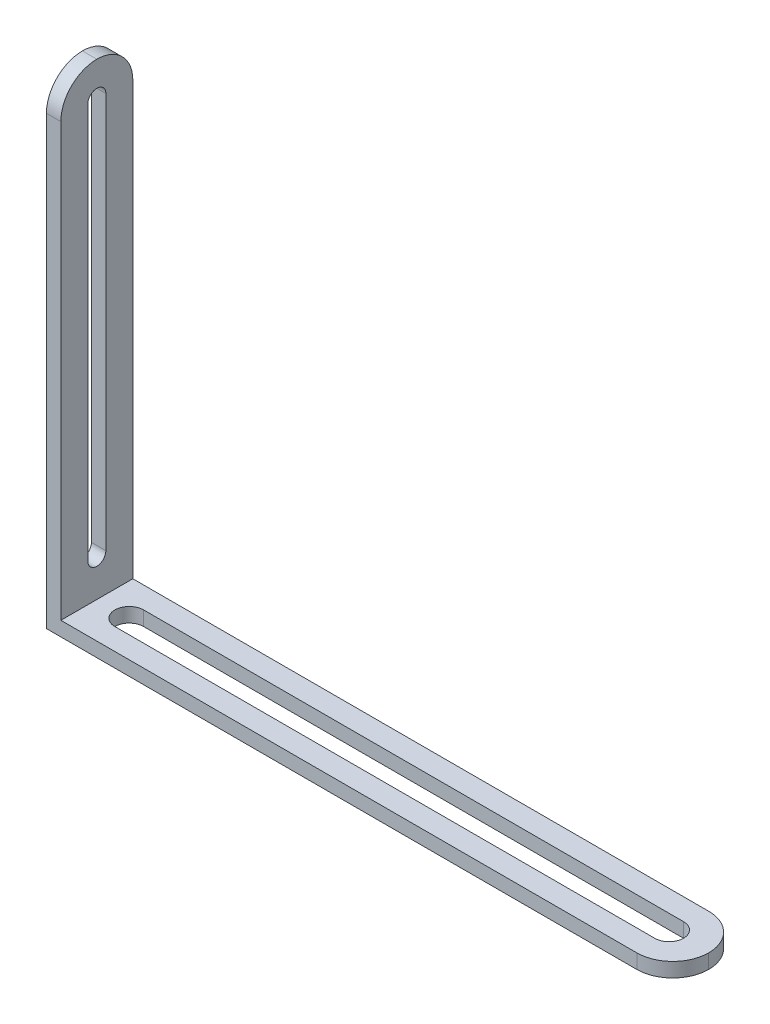
ISO-10303-21;
HEADER;
FILE_DESCRIPTION(('STEP AP214'),'2;1');
FILE_NAME('part.step','',(''),(''),'','','');
FILE_SCHEMA(('AUTOMOTIVE_DESIGN { 1 0 10303 214 1 1 1 1 }'));
ENDSEC;
DATA;
#1=APPLICATION_CONTEXT('core data for automotive mechanical design processes');
#2=APPLICATION_PROTOCOL_DEFINITION('international standard','automotive_design',2000,#1);
#3=PRODUCT_CONTEXT('',#1,'mechanical');
#4=PRODUCT('Part','Part','',(#3));
#5=PRODUCT_RELATED_PRODUCT_CATEGORY('part','',(#4));
#6=PRODUCT_DEFINITION_FORMATION('','',#4);
#7=PRODUCT_DEFINITION_CONTEXT('part definition',#1,'design');
#8=PRODUCT_DEFINITION('design','',#6,#7);
#9=PRODUCT_DEFINITION_SHAPE('','',#8);
#10=(LENGTH_UNIT() NAMED_UNIT(*) SI_UNIT(.MILLI.,.METRE.));
#11=(NAMED_UNIT(*) PLANE_ANGLE_UNIT() SI_UNIT($,.RADIAN.));
#12=(NAMED_UNIT(*) SI_UNIT($,.STERADIAN.) SOLID_ANGLE_UNIT());
#13=UNCERTAINTY_MEASURE_WITH_UNIT(LENGTH_MEASURE(1.E-05),#10,'distance_accuracy_value','');
#14=(GEOMETRIC_REPRESENTATION_CONTEXT(3) GLOBAL_UNCERTAINTY_ASSIGNED_CONTEXT((#13)) GLOBAL_UNIT_ASSIGNED_CONTEXT((#10,
#11,#12)) REPRESENTATION_CONTEXT('',''));
#15=CARTESIAN_POINT('',(0.,0.,0.));
#16=DIRECTION('',(0.,0.,1.));
#17=DIRECTION('',(1.,0.,0.));
#18=AXIS2_PLACEMENT_3D('',#15,#16,#17);
#19=CARTESIAN_POINT('',(0.,0.,-25.4));
#20=DIRECTION('',(-1.,0.,0.));
#21=DIRECTION('',(0.,0.,1.));
#22=AXIS2_PLACEMENT_3D('',#19,#20,#21);
#23=PLANE('',#22);
#24=CARTESIAN_POINT('',(0.,158.115,-12.7));
#25=DIRECTION('',(-1.,0.,0.));
#26=DIRECTION('',(0.,0.,1.));
#27=AXIS2_PLACEMENT_3D('',#24,#25,#26);
#28=CIRCLE('',#27,3.175);
#29=CARTESIAN_POINT('',(0.,158.115,-9.525));
#30=VERTEX_POINT('',#29);
#31=CARTESIAN_POINT('',(0.,158.115,-15.875));
#32=VERTEX_POINT('',#31);
#33=EDGE_CURVE('E228',#30,#32,#28,.T.);
#34=ORIENTED_EDGE('',*,*,#33,.F.);
#35=DIRECTION('',(0.,1.,0.));
#36=VECTOR('',#35,1.);
#37=CARTESIAN_POINT('',(0.,0.,-9.52500000000002));
#38=LINE('',#37,#36);
#39=CARTESIAN_POINT('',(0.,18.415,-9.52500000000002));
#40=VERTEX_POINT('',#39);
#41=EDGE_CURVE('E209',#40,#30,#38,.T.);
#42=ORIENTED_EDGE('',*,*,#41,.F.);
#43=CARTESIAN_POINT('',(0.,18.415,-12.7));
#44=DIRECTION('',(-1.,0.,0.));
#45=DIRECTION('',(0.,0.,1.));
#46=AXIS2_PLACEMENT_3D('',#43,#44,#45);
#47=CIRCLE('',#46,3.175);
#48=CARTESIAN_POINT('',(0.,18.415,-15.875));
#49=VERTEX_POINT('',#48);
#50=EDGE_CURVE('E221',#49,#40,#47,.T.);
#51=ORIENTED_EDGE('',*,*,#50,.F.);
#52=DIRECTION('',(0.,-1.,0.));
#53=VECTOR('',#52,1.);
#54=CARTESIAN_POINT('',(0.,0.,-15.875));
#55=LINE('',#54,#53);
#56=EDGE_CURVE('E225',#32,#49,#55,.T.);
#57=ORIENTED_EDGE('',*,*,#56,.F.);
#58=EDGE_LOOP('',(#34,#42,#51,#57));
#59=FACE_BOUND('',#58,.T.);
#60=CARTESIAN_POINT('',(0.,157.48,-12.7));
#61=DIRECTION('',(-1.,0.,0.));
#62=DIRECTION('',(0.,0.,1.));
#63=AXIS2_PLACEMENT_3D('',#60,#61,#62);
#64=CIRCLE('',#63,12.7);
#65=CARTESIAN_POINT('',(0.,157.48,0.));
#66=VERTEX_POINT('',#65);
#67=CARTESIAN_POINT('',(0.,170.18,-12.7));
#68=VERTEX_POINT('',#67);
#69=EDGE_CURVE('E295',#66,#68,#64,.T.);
#70=ORIENTED_EDGE('',*,*,#69,.T.);
#71=CARTESIAN_POINT('',(0.,157.48,-12.7));
#72=DIRECTION('',(-1.,0.,0.));
#73=DIRECTION('',(0.,0.,1.));
#74=AXIS2_PLACEMENT_3D('',#71,#72,#73);
#75=CIRCLE('',#74,12.7);
#76=CARTESIAN_POINT('',(0.,157.48,-25.4));
#77=VERTEX_POINT('',#76);
#78=EDGE_CURVE('E298',#68,#77,#75,.T.);
#79=ORIENTED_EDGE('',*,*,#78,.T.);
#80=DIRECTION('',(0.,-1.,0.));
#81=VECTOR('',#80,1.);
#82=CARTESIAN_POINT('',(0.,0.,-25.4));
#83=LINE('',#82,#81);
#84=CARTESIAN_POINT('',(0.,0.,-25.4));
#85=VERTEX_POINT('',#84);
#86=EDGE_CURVE('E232',#77,#85,#83,.T.);
#87=ORIENTED_EDGE('',*,*,#86,.T.);
#88=DIRECTION('',(0.,0.,1.));
#89=VECTOR('',#88,1.);
#90=CARTESIAN_POINT('',(0.,0.,-25.4));
#91=LINE('',#90,#89);
#92=CARTESIAN_POINT('',(0.,0.,0.));
#93=VERTEX_POINT('',#92);
#94=EDGE_CURVE('E247',#85,#93,#91,.T.);
#95=ORIENTED_EDGE('',*,*,#94,.T.);
#96=DIRECTION('',(0.,-1.,0.));
#97=VECTOR('',#96,1.);
#98=CARTESIAN_POINT('',(0.,0.,0.));
#99=LINE('',#98,#97);
#100=EDGE_CURVE('E248',#66,#93,#99,.T.);
#101=ORIENTED_EDGE('',*,*,#100,.F.);
#102=EDGE_LOOP('',(#70,#79,#87,#95,#101));
#103=FACE_BOUND('',#102,.T.);
#104=ADVANCED_FACE('F41',(#59,#103),#23,.T.);
#105=CARTESIAN_POINT('',(5.07999999999996,170.18,-25.4));
#106=DIRECTION('',(1.,0.,0.));
#107=DIRECTION('',(0.,1.,0.));
#108=AXIS2_PLACEMENT_3D('',#105,#106,#107);
#109=PLANE('',#108);
#110=CARTESIAN_POINT('',(5.07999999999996,158.115,-12.7));
#111=DIRECTION('',(1.,0.,0.));
#112=DIRECTION('',(0.,1.,0.));
#113=AXIS2_PLACEMENT_3D('',#110,#111,#112);
#114=CIRCLE('',#113,3.175);
#115=CARTESIAN_POINT('',(5.07999999999996,158.115,-15.875));
#116=VERTEX_POINT('',#115);
#117=CARTESIAN_POINT('',(5.07999999999996,158.115,-9.525));
#118=VERTEX_POINT('',#117);
#119=EDGE_CURVE('E186',#116,#118,#114,.T.);
#120=ORIENTED_EDGE('',*,*,#119,.F.);
#121=DIRECTION('',(0.,1.,0.));
#122=VECTOR('',#121,1.);
#123=CARTESIAN_POINT('',(5.07999999999996,158.115,-15.875));
#124=LINE('',#123,#122);
#125=CARTESIAN_POINT('',(5.07999999999998,18.415,-15.875));
#126=VERTEX_POINT('',#125);
#127=EDGE_CURVE('E201',#126,#116,#124,.T.);
#128=ORIENTED_EDGE('',*,*,#127,.F.);
#129=CARTESIAN_POINT('',(5.07999999999998,18.415,-12.7));
#130=DIRECTION('',(1.,0.,0.));
#131=DIRECTION('',(0.,1.,0.));
#132=AXIS2_PLACEMENT_3D('',#129,#130,#131);
#133=CIRCLE('',#132,3.175);
#134=CARTESIAN_POINT('',(5.07999999999998,18.415,-9.52500000000002));
#135=VERTEX_POINT('',#134);
#136=EDGE_CURVE('E197',#135,#126,#133,.T.);
#137=ORIENTED_EDGE('',*,*,#136,.F.);
#138=DIRECTION('',(0.,-1.,0.));
#139=VECTOR('',#138,1.);
#140=CARTESIAN_POINT('',(5.07999999999996,158.115,-9.525));
#141=LINE('',#140,#139);
#142=EDGE_CURVE('E193',#118,#135,#141,.T.);
#143=ORIENTED_EDGE('',*,*,#142,.F.);
#144=EDGE_LOOP('',(#120,#128,#137,#143));
#145=FACE_BOUND('',#144,.T.);
#146=DIRECTION('',(0.,1.,0.));
#147=VECTOR('',#146,1.);
#148=CARTESIAN_POINT('',(5.07999999999996,170.18,-25.4));
#149=LINE('',#148,#147);
#150=CARTESIAN_POINT('',(5.07999999999998,5.08,-25.4));
#151=VERTEX_POINT('',#150);
#152=CARTESIAN_POINT('',(5.07999999999996,157.48,-25.4));
#153=VERTEX_POINT('',#152);
#154=EDGE_CURVE('E243',#151,#153,#149,.T.);
#155=ORIENTED_EDGE('',*,*,#154,.T.);
#156=CARTESIAN_POINT('',(5.07999999999996,157.48,-12.7));
#157=DIRECTION('',(1.,0.,0.));
#158=DIRECTION('',(0.,1.,0.));
#159=AXIS2_PLACEMENT_3D('',#156,#157,#158);
#160=CIRCLE('',#159,12.7);
#161=CARTESIAN_POINT('',(5.07999999999996,170.18,-12.7));
#162=VERTEX_POINT('',#161);
#163=EDGE_CURVE('E304',#153,#162,#160,.T.);
#164=ORIENTED_EDGE('',*,*,#163,.T.);
#165=CARTESIAN_POINT('',(5.07999999999996,157.48,-12.7));
#166=DIRECTION('',(1.,0.,0.));
#167=DIRECTION('',(0.,1.,0.));
#168=AXIS2_PLACEMENT_3D('',#165,#166,#167);
#169=CIRCLE('',#168,12.7);
#170=CARTESIAN_POINT('',(5.07999999999996,157.48,0.));
#171=VERTEX_POINT('',#170);
#172=EDGE_CURVE('E301',#162,#171,#169,.T.);
#173=ORIENTED_EDGE('',*,*,#172,.T.);
#174=DIRECTION('',(0.,1.,0.));
#175=VECTOR('',#174,1.);
#176=CARTESIAN_POINT('',(5.07999999999996,170.18,0.));
#177=LINE('',#176,#175);
#178=CARTESIAN_POINT('',(5.07999999999998,5.08,0.));
#179=VERTEX_POINT('',#178);
#180=EDGE_CURVE('E236',#179,#171,#177,.T.);
#181=ORIENTED_EDGE('',*,*,#180,.F.);
#182=DIRECTION('',(0.,0.,1.));
#183=VECTOR('',#182,1.);
#184=CARTESIAN_POINT('',(5.07999999999998,5.08,-25.4));
#185=LINE('',#184,#183);
#186=EDGE_CURVE('E262',#151,#179,#185,.T.);
#187=ORIENTED_EDGE('',*,*,#186,.F.);
#188=EDGE_LOOP('',(#155,#164,#173,#181,#187));
#189=FACE_BOUND('',#188,.T.);
#190=ADVANCED_FACE('F345',(#145,#189),#109,.T.);
#191=CARTESIAN_POINT('',(5.07999999999998,5.08,-25.4));
#192=DIRECTION('',(0.,1.,0.));
#193=DIRECTION('',(0.,0.,1.));
#194=AXIS2_PLACEMENT_3D('',#191,#192,#193);
#195=PLANE('',#194);
#196=CARTESIAN_POINT('',(207.01,5.08,-12.7));
#197=DIRECTION('',(0.,1.,0.));
#198=DIRECTION('',(0.,0.,1.));
#199=AXIS2_PLACEMENT_3D('',#196,#197,#198);
#200=CIRCLE('',#199,5.07999999999999);
#201=CARTESIAN_POINT('',(207.01,5.08,-7.62000000000001));
#202=VERTEX_POINT('',#201);
#203=CARTESIAN_POINT('',(207.01,5.08,-17.78));
#204=VERTEX_POINT('',#203);
#205=EDGE_CURVE('E57',#202,#204,#200,.T.);
#206=ORIENTED_EDGE('',*,*,#205,.F.);
#207=DIRECTION('',(1.,0.,0.));
#208=VECTOR('',#207,1.);
#209=CARTESIAN_POINT('',(207.01,5.08,-7.62000000000001));
#210=LINE('',#209,#208);
#211=CARTESIAN_POINT('',(16.5099999999999,5.08,-7.62000000000001));
#212=VERTEX_POINT('',#211);
#213=EDGE_CURVE('E175',#212,#202,#210,.T.);
#214=ORIENTED_EDGE('',*,*,#213,.F.);
#215=CARTESIAN_POINT('',(16.5099999999999,5.08,-12.7));
#216=DIRECTION('',(0.,1.,0.));
#217=DIRECTION('',(0.,0.,1.));
#218=AXIS2_PLACEMENT_3D('',#215,#216,#217);
#219=CIRCLE('',#218,5.07999999999999);
#220=CARTESIAN_POINT('',(16.5099999999999,5.08,-17.78));
#221=VERTEX_POINT('',#220);
#222=EDGE_CURVE('E157',#221,#212,#219,.T.);
#223=ORIENTED_EDGE('',*,*,#222,.F.);
#224=DIRECTION('',(-1.,0.,0.));
#225=VECTOR('',#224,1.);
#226=CARTESIAN_POINT('',(207.01,5.08,-17.78));
#227=LINE('',#226,#225);
#228=EDGE_CURVE('E167',#204,#221,#227,.T.);
#229=ORIENTED_EDGE('',*,*,#228,.F.);
#230=EDGE_LOOP('',(#206,#214,#223,#229));
#231=FACE_BOUND('',#230,.T.);
#232=CARTESIAN_POINT('',(208.28,5.08,-12.7));
#233=DIRECTION('',(0.,1.,0.));
#234=DIRECTION('',(0.,0.,1.));
#235=AXIS2_PLACEMENT_3D('',#232,#233,#234);
#236=CIRCLE('',#235,12.7);
#237=CARTESIAN_POINT('',(208.28,5.08,0.));
#238=VERTEX_POINT('',#237);
#239=CARTESIAN_POINT('',(220.98,5.08,-12.7));
#240=VERTEX_POINT('',#239);
#241=EDGE_CURVE('E266',#238,#240,#236,.T.);
#242=ORIENTED_EDGE('',*,*,#241,.T.);
#243=CARTESIAN_POINT('',(208.28,5.08,-12.7));
#244=DIRECTION('',(0.,1.,0.));
#245=DIRECTION('',(0.,0.,1.));
#246=AXIS2_PLACEMENT_3D('',#243,#244,#245);
#247=CIRCLE('',#246,12.7);
#248=CARTESIAN_POINT('',(208.28,5.08,-25.4));
#249=VERTEX_POINT('',#248);
#250=EDGE_CURVE('E272',#240,#249,#247,.T.);
#251=ORIENTED_EDGE('',*,*,#250,.T.);
#252=DIRECTION('',(-1.,0.,0.));
#253=VECTOR('',#252,1.);
#254=CARTESIAN_POINT('',(5.07999999999998,5.08,-25.4));
#255=LINE('',#254,#253);
#256=EDGE_CURVE('E240',#249,#151,#255,.T.);
#257=ORIENTED_EDGE('',*,*,#256,.T.);
#258=ORIENTED_EDGE('',*,*,#186,.T.);
#259=DIRECTION('',(-1.,0.,0.));
#260=VECTOR('',#259,1.);
#261=CARTESIAN_POINT('',(5.07999999999998,5.08,0.));
#262=LINE('',#261,#260);
#263=EDGE_CURVE('E256',#238,#179,#262,.T.);
#264=ORIENTED_EDGE('',*,*,#263,.F.);
#265=EDGE_LOOP('',(#242,#251,#257,#258,#264));
#266=FACE_BOUND('',#265,.T.);
#267=ADVANCED_FACE('F172',(#231,#266),#195,.T.);
#268=CARTESIAN_POINT('',(220.98,0.,-25.4));
#269=DIRECTION('',(0.,-1.,0.));
#270=DIRECTION('',(1.,0.,0.));
#271=AXIS2_PLACEMENT_3D('',#268,#269,#270);
#272=PLANE('',#271);
#273=CARTESIAN_POINT('',(207.01,0.,-12.7));
#274=DIRECTION('',(0.,-1.,0.));
#275=DIRECTION('',(1.,0.,0.));
#276=AXIS2_PLACEMENT_3D('',#273,#274,#275);
#277=CIRCLE('',#276,5.07999999999999);
#278=CARTESIAN_POINT('',(207.01,0.,-17.78));
#279=VERTEX_POINT('',#278);
#280=CARTESIAN_POINT('',(207.01,0.,-7.62000000000001));
#281=VERTEX_POINT('',#280);
#282=EDGE_CURVE('E11',#279,#281,#277,.T.);
#283=ORIENTED_EDGE('',*,*,#282,.F.);
#284=DIRECTION('',(1.,0.,0.));
#285=VECTOR('',#284,1.);
#286=CARTESIAN_POINT('',(220.98,0.,-17.78));
#287=LINE('',#286,#285);
#288=CARTESIAN_POINT('',(16.5099999999999,0.,-17.78));
#289=VERTEX_POINT('',#288);
#290=EDGE_CURVE('E307',#289,#279,#287,.T.);
#291=ORIENTED_EDGE('',*,*,#290,.F.);
#292=CARTESIAN_POINT('',(16.5099999999999,0.,-12.7));
#293=DIRECTION('',(0.,-1.,0.));
#294=DIRECTION('',(1.,0.,0.));
#295=AXIS2_PLACEMENT_3D('',#292,#293,#294);
#296=CIRCLE('',#295,5.07999999999999);
#297=CARTESIAN_POINT('',(16.5099999999999,0.,-7.62000000000001));
#298=VERTEX_POINT('',#297);
#299=EDGE_CURVE('E160',#298,#289,#296,.T.);
#300=ORIENTED_EDGE('',*,*,#299,.F.);
#301=DIRECTION('',(-1.,0.,0.));
#302=VECTOR('',#301,1.);
#303=CARTESIAN_POINT('',(220.98,0.,-7.62000000000002));
#304=LINE('',#303,#302);
#305=EDGE_CURVE('E50',#281,#298,#304,.T.);
#306=ORIENTED_EDGE('',*,*,#305,.F.);
#307=EDGE_LOOP('',(#283,#291,#300,#306));
#308=FACE_BOUND('',#307,.T.);
#309=DIRECTION('',(1.,0.,0.));
#310=VECTOR('',#309,1.);
#311=CARTESIAN_POINT('',(220.98,0.,-25.4));
#312=LINE('',#311,#310);
#313=CARTESIAN_POINT('',(208.28,0.,-25.4));
#314=VERTEX_POINT('',#313);
#315=EDGE_CURVE('E235',#85,#314,#312,.T.);
#316=ORIENTED_EDGE('',*,*,#315,.T.);
#317=CARTESIAN_POINT('',(208.28,0.,-12.7));
#318=DIRECTION('',(0.,-1.,0.));
#319=DIRECTION('',(1.,0.,0.));
#320=AXIS2_PLACEMENT_3D('',#317,#318,#319);
#321=CIRCLE('',#320,12.7);
#322=CARTESIAN_POINT('',(220.98,0.,-12.7));
#323=VERTEX_POINT('',#322);
#324=EDGE_CURVE('E286',#314,#323,#321,.T.);
#325=ORIENTED_EDGE('',*,*,#324,.T.);
#326=CARTESIAN_POINT('',(208.28,0.,-12.7));
#327=DIRECTION('',(0.,-1.,0.));
#328=DIRECTION('',(1.,0.,0.));
#329=AXIS2_PLACEMENT_3D('',#326,#327,#328);
#330=CIRCLE('',#329,12.7);
#331=CARTESIAN_POINT('',(208.28,0.,0.));
#332=VERTEX_POINT('',#331);
#333=EDGE_CURVE('E283',#323,#332,#330,.T.);
#334=ORIENTED_EDGE('',*,*,#333,.T.);
#335=DIRECTION('',(1.,0.,0.));
#336=VECTOR('',#335,1.);
#337=CARTESIAN_POINT('',(220.98,0.,0.));
#338=LINE('',#337,#336);
#339=EDGE_CURVE('E251',#93,#332,#338,.T.);
#340=ORIENTED_EDGE('',*,*,#339,.F.);
#341=ORIENTED_EDGE('',*,*,#94,.F.);
#342=EDGE_LOOP('',(#316,#325,#334,#340,#341));
#343=FACE_BOUND('',#342,.T.);
#344=ADVANCED_FACE('F325',(#308,#343),#272,.T.);
#345=CARTESIAN_POINT('',(0.,0.,-25.4));
#346=DIRECTION('',(0.,0.,-1.));
#347=DIRECTION('',(-1.,0.,0.));
#348=AXIS2_PLACEMENT_3D('',#345,#346,#347);
#349=PLANE('',#348);
#350=ORIENTED_EDGE('',*,*,#256,.F.);
#351=DIRECTION('',(0.,1.,0.));
#352=VECTOR('',#351,1.);
#353=CARTESIAN_POINT('',(208.28,0.,-25.4));
#354=LINE('',#353,#352);
#355=EDGE_CURVE('E279',#249,#314,#354,.F.);
#356=ORIENTED_EDGE('',*,*,#355,.T.);
#357=ORIENTED_EDGE('',*,*,#315,.F.);
#358=ORIENTED_EDGE('',*,*,#86,.F.);
#359=DIRECTION('',(-1.,0.,0.));
#360=VECTOR('',#359,1.);
#361=CARTESIAN_POINT('',(0.,157.48,-25.4));
#362=LINE('',#361,#360);
#363=EDGE_CURVE('E275',#77,#153,#362,.F.);
#364=ORIENTED_EDGE('',*,*,#363,.T.);
#365=ORIENTED_EDGE('',*,*,#154,.F.);
#366=EDGE_LOOP('',(#350,#356,#357,#358,#364,#365));
#367=FACE_BOUND('',#366,.T.);
#368=ADVANCED_FACE('F387',(#367),#349,.T.);
#369=CARTESIAN_POINT('',(0.,0.,0.));
#370=DIRECTION('',(0.,0.,-1.));
#371=DIRECTION('',(-1.,0.,0.));
#372=AXIS2_PLACEMENT_3D('',#369,#370,#371);
#373=PLANE('',#372);
#374=ORIENTED_EDGE('',*,*,#339,.T.);
#375=DIRECTION('',(0.,1.,0.));
#376=VECTOR('',#375,1.);
#377=CARTESIAN_POINT('',(208.28,5.08,0.));
#378=LINE('',#377,#376);
#379=EDGE_CURVE('E292',#332,#238,#378,.T.);
#380=ORIENTED_EDGE('',*,*,#379,.T.);
#381=ORIENTED_EDGE('',*,*,#263,.T.);
#382=ORIENTED_EDGE('',*,*,#180,.T.);
#383=DIRECTION('',(-1.,0.,0.));
#384=VECTOR('',#383,1.);
#385=CARTESIAN_POINT('',(0.,157.48,0.));
#386=LINE('',#385,#384);
#387=EDGE_CURVE('E289',#171,#66,#386,.T.);
#388=ORIENTED_EDGE('',*,*,#387,.T.);
#389=ORIENTED_EDGE('',*,*,#100,.T.);
#390=EDGE_LOOP('',(#374,#380,#381,#382,#388,#389));
#391=FACE_BOUND('',#390,.T.);
#392=ADVANCED_FACE('F364',(#391),#373,.F.);
#393=CARTESIAN_POINT('',(208.28,0.,-12.7));
#394=DIRECTION('',(0.,-1.,0.));
#395=DIRECTION('',(0.,0.,-1.));
#396=AXIS2_PLACEMENT_3D('',#393,#394,#395);
#397=CYLINDRICAL_SURFACE('',#396,12.7);
#398=ORIENTED_EDGE('',*,*,#379,.F.);
#399=ORIENTED_EDGE('',*,*,#333,.F.);
#400=DIRECTION('',(0.,1.,0.));
#401=VECTOR('',#400,1.);
#402=CARTESIAN_POINT('',(220.98,0.,-12.7));
#403=LINE('',#402,#401);
#404=EDGE_CURVE('E252',#240,#323,#403,.F.);
#405=ORIENTED_EDGE('',*,*,#404,.F.);
#406=ORIENTED_EDGE('',*,*,#241,.F.);
#407=EDGE_LOOP('',(#398,#399,#405,#406));
#408=FACE_BOUND('',#407,.T.);
#409=ADVANCED_FACE('F361',(#408),#397,.T.);
#410=CARTESIAN_POINT('',(208.28,5.08,-12.7));
#411=DIRECTION('',(0.,1.,0.));
#412=DIRECTION('',(0.,0.,1.));
#413=AXIS2_PLACEMENT_3D('',#410,#411,#412);
#414=CYLINDRICAL_SURFACE('',#413,12.7);
#415=ORIENTED_EDGE('',*,*,#324,.F.);
#416=ORIENTED_EDGE('',*,*,#355,.F.);
#417=ORIENTED_EDGE('',*,*,#250,.F.);
#418=ORIENTED_EDGE('',*,*,#404,.T.);
#419=EDGE_LOOP('',(#415,#416,#417,#418));
#420=FACE_BOUND('',#419,.T.);
#421=ADVANCED_FACE('F358',(#420),#414,.T.);
#422=CARTESIAN_POINT('',(0.,157.48,-12.7));
#423=DIRECTION('',(1.,0.,0.));
#424=DIRECTION('',(0.,0.,-1.));
#425=AXIS2_PLACEMENT_3D('',#422,#423,#424);
#426=CYLINDRICAL_SURFACE('',#425,12.7);
#427=ORIENTED_EDGE('',*,*,#387,.F.);
#428=ORIENTED_EDGE('',*,*,#172,.F.);
#429=DIRECTION('',(-1.,0.,0.));
#430=VECTOR('',#429,1.);
#431=CARTESIAN_POINT('',(5.07999999999996,170.18,-12.7));
#432=LINE('',#431,#430);
#433=EDGE_CURVE('E231',#68,#162,#432,.F.);
#434=ORIENTED_EDGE('',*,*,#433,.F.);
#435=ORIENTED_EDGE('',*,*,#69,.F.);
#436=EDGE_LOOP('',(#427,#428,#434,#435));
#437=FACE_BOUND('',#436,.T.);
#438=ADVANCED_FACE('F43',(#437),#426,.T.);
#439=CARTESIAN_POINT('',(0.,157.48,-12.7));
#440=DIRECTION('',(-1.,0.,0.));
#441=DIRECTION('',(0.,0.,1.));
#442=AXIS2_PLACEMENT_3D('',#439,#440,#441);
#443=CYLINDRICAL_SURFACE('',#442,12.7);
#444=ORIENTED_EDGE('',*,*,#163,.F.);
#445=ORIENTED_EDGE('',*,*,#363,.F.);
#446=ORIENTED_EDGE('',*,*,#78,.F.);
#447=ORIENTED_EDGE('',*,*,#433,.T.);
#448=EDGE_LOOP('',(#444,#445,#446,#447));
#449=FACE_BOUND('',#448,.T.);
#450=ADVANCED_FACE('F366',(#449),#443,.T.);
#451=CARTESIAN_POINT('',(-20.32,158.115,-12.7));
#452=DIRECTION('',(1.,0.,0.));
#453=DIRECTION('',(0.,1.,0.));
#454=AXIS2_PLACEMENT_3D('',#451,#452,#453);
#455=CYLINDRICAL_SURFACE('',#454,3.175);
#456=ORIENTED_EDGE('',*,*,#33,.T.);
#457=DIRECTION('',(1.,0.,0.));
#458=VECTOR('',#457,1.);
#459=CARTESIAN_POINT('',(-20.32,158.115,-15.875));
#460=LINE('',#459,#458);
#461=EDGE_CURVE('E206',#32,#116,#460,.T.);
#462=ORIENTED_EDGE('',*,*,#461,.T.);
#463=ORIENTED_EDGE('',*,*,#119,.T.);
#464=DIRECTION('',(1.,0.,0.));
#465=VECTOR('',#464,1.);
#466=CARTESIAN_POINT('',(-20.32,158.115,-9.525));
#467=LINE('',#466,#465);
#468=EDGE_CURVE('E205',#30,#118,#467,.T.);
#469=ORIENTED_EDGE('',*,*,#468,.F.);
#470=EDGE_LOOP('',(#456,#462,#463,#469));
#471=FACE_BOUND('',#470,.T.);
#472=ADVANCED_FACE('F368',(#471),#455,.F.);
#473=CARTESIAN_POINT('',(-20.32,158.115,-15.875));
#474=DIRECTION('',(0.,0.,-1.));
#475=DIRECTION('',(0.,1.,0.));
#476=AXIS2_PLACEMENT_3D('',#473,#474,#475);
#477=PLANE('',#476);
#478=ORIENTED_EDGE('',*,*,#56,.T.);
#479=DIRECTION('',(1.,0.,0.));
#480=VECTOR('',#479,1.);
#481=CARTESIAN_POINT('',(-20.32,18.415,-15.875));
#482=LINE('',#481,#480);
#483=EDGE_CURVE('E210',#49,#126,#482,.T.);
#484=ORIENTED_EDGE('',*,*,#483,.T.);
#485=ORIENTED_EDGE('',*,*,#127,.T.);
#486=ORIENTED_EDGE('',*,*,#461,.F.);
#487=EDGE_LOOP('',(#478,#484,#485,#486));
#488=FACE_BOUND('',#487,.T.);
#489=ADVANCED_FACE('F374',(#488),#477,.F.);
#490=CARTESIAN_POINT('',(-20.32,18.415,-12.7));
#491=DIRECTION('',(1.,0.,0.));
#492=DIRECTION('',(0.,1.,0.));
#493=AXIS2_PLACEMENT_3D('',#490,#491,#492);
#494=CYLINDRICAL_SURFACE('',#493,3.175);
#495=ORIENTED_EDGE('',*,*,#50,.T.);
#496=DIRECTION('',(1.,0.,0.));
#497=VECTOR('',#496,1.);
#498=CARTESIAN_POINT('',(-20.32,18.415,-9.52500000000002));
#499=LINE('',#498,#497);
#500=EDGE_CURVE('E213',#40,#135,#499,.T.);
#501=ORIENTED_EDGE('',*,*,#500,.T.);
#502=ORIENTED_EDGE('',*,*,#136,.T.);
#503=ORIENTED_EDGE('',*,*,#483,.F.);
#504=EDGE_LOOP('',(#495,#501,#502,#503));
#505=FACE_BOUND('',#504,.T.);
#506=ADVANCED_FACE('F339',(#505),#494,.F.);
#507=CARTESIAN_POINT('',(-20.32,158.115,-9.525));
#508=DIRECTION('',(0.,0.,1.));
#509=DIRECTION('',(0.,-1.,0.));
#510=AXIS2_PLACEMENT_3D('',#507,#508,#509);
#511=PLANE('',#510);
#512=ORIENTED_EDGE('',*,*,#41,.T.);
#513=ORIENTED_EDGE('',*,*,#468,.T.);
#514=ORIENTED_EDGE('',*,*,#142,.T.);
#515=ORIENTED_EDGE('',*,*,#500,.F.);
#516=EDGE_LOOP('',(#512,#513,#514,#515));
#517=FACE_BOUND('',#516,.T.);
#518=ADVANCED_FACE('F332',(#517),#511,.F.);
#519=CARTESIAN_POINT('',(207.01,-20.32,-12.7));
#520=DIRECTION('',(0.,1.,0.));
#521=DIRECTION('',(0.,0.,1.));
#522=AXIS2_PLACEMENT_3D('',#519,#520,#521);
#523=CYLINDRICAL_SURFACE('',#522,5.07999999999999);
#524=ORIENTED_EDGE('',*,*,#282,.T.);
#525=DIRECTION('',(0.,1.,0.));
#526=VECTOR('',#525,1.);
#527=CARTESIAN_POINT('',(207.01,-20.32,-7.62000000000001));
#528=LINE('',#527,#526);
#529=EDGE_CURVE('E183',#281,#202,#528,.T.);
#530=ORIENTED_EDGE('',*,*,#529,.T.);
#531=ORIENTED_EDGE('',*,*,#205,.T.);
#532=DIRECTION('',(0.,1.,0.));
#533=VECTOR('',#532,1.);
#534=CARTESIAN_POINT('',(207.01,-20.32,-17.78));
#535=LINE('',#534,#533);
#536=EDGE_CURVE('E164',#279,#204,#535,.T.);
#537=ORIENTED_EDGE('',*,*,#536,.F.);
#538=EDGE_LOOP('',(#524,#530,#531,#537));
#539=FACE_BOUND('',#538,.T.);
#540=ADVANCED_FACE('F327',(#539),#523,.F.);
#541=CARTESIAN_POINT('',(207.01,-20.32,-7.62000000000001));
#542=DIRECTION('',(0.,0.,1.));
#543=DIRECTION('',(1.,0.,0.));
#544=AXIS2_PLACEMENT_3D('',#541,#542,#543);
#545=PLANE('',#544);
#546=ORIENTED_EDGE('',*,*,#305,.T.);
#547=DIRECTION('',(0.,1.,0.));
#548=VECTOR('',#547,1.);
#549=CARTESIAN_POINT('',(16.5099999999999,-20.32,-7.62000000000001));
#550=LINE('',#549,#548);
#551=EDGE_CURVE('E163',#298,#212,#550,.T.);
#552=ORIENTED_EDGE('',*,*,#551,.T.);
#553=ORIENTED_EDGE('',*,*,#213,.T.);
#554=ORIENTED_EDGE('',*,*,#529,.F.);
#555=EDGE_LOOP('',(#546,#552,#553,#554));
#556=FACE_BOUND('',#555,.T.);
#557=ADVANCED_FACE('F322',(#556),#545,.F.);
#558=CARTESIAN_POINT('',(16.5099999999999,-20.32,-12.7));
#559=DIRECTION('',(0.,1.,0.));
#560=DIRECTION('',(0.,0.,1.));
#561=AXIS2_PLACEMENT_3D('',#558,#559,#560);
#562=CYLINDRICAL_SURFACE('',#561,5.07999999999999);
#563=ORIENTED_EDGE('',*,*,#299,.T.);
#564=DIRECTION('',(0.,1.,0.));
#565=VECTOR('',#564,1.);
#566=CARTESIAN_POINT('',(16.5099999999999,-20.32,-17.78));
#567=LINE('',#566,#565);
#568=EDGE_CURVE('E65',#289,#221,#567,.T.);
#569=ORIENTED_EDGE('',*,*,#568,.T.);
#570=ORIENTED_EDGE('',*,*,#222,.T.);
#571=ORIENTED_EDGE('',*,*,#551,.F.);
#572=EDGE_LOOP('',(#563,#569,#570,#571));
#573=FACE_BOUND('',#572,.T.);
#574=ADVANCED_FACE('F154',(#573),#562,.F.);
#575=CARTESIAN_POINT('',(207.01,-20.32,-17.78));
#576=DIRECTION('',(0.,0.,-1.));
#577=DIRECTION('',(-1.,0.,0.));
#578=AXIS2_PLACEMENT_3D('',#575,#576,#577);
#579=PLANE('',#578);
#580=ORIENTED_EDGE('',*,*,#290,.T.);
#581=ORIENTED_EDGE('',*,*,#536,.T.);
#582=ORIENTED_EDGE('',*,*,#228,.T.);
#583=ORIENTED_EDGE('',*,*,#568,.F.);
#584=EDGE_LOOP('',(#580,#581,#582,#583));
#585=FACE_BOUND('',#584,.T.);
#586=ADVANCED_FACE('F168',(#585),#579,.F.);
#587=CLOSED_SHELL('',(#104,#190,#267,#344,#368,#392,#409,#421,#438,#450,#472,#489,#506,#518,
#540,#557,#574,#586));
#588=MANIFOLD_SOLID_BREP('B2',#587);
#589=ADVANCED_BREP_SHAPE_REPRESENTATION('',(#18,#588),#14);
#590=SHAPE_DEFINITION_REPRESENTATION(#9,#589);
ENDSEC;
END-ISO-10303-21;
